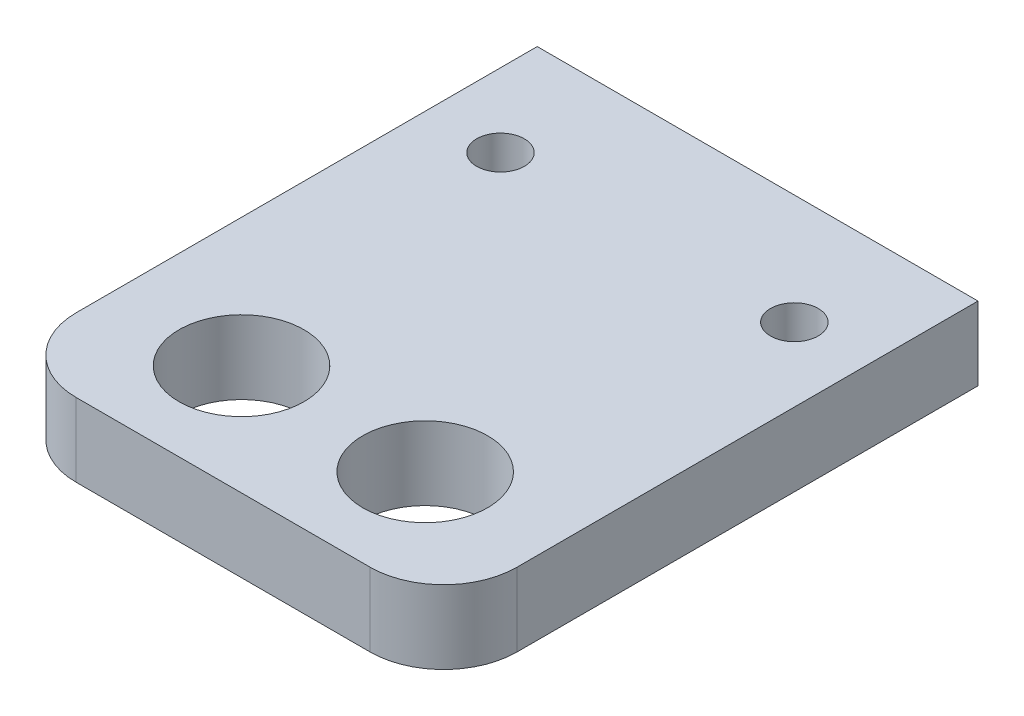
ISO-10303-21;
HEADER;
FILE_DESCRIPTION(('STEP AP214'),'2;1');
FILE_NAME('part.step','',(''),(''),'','','');
FILE_SCHEMA(('AUTOMOTIVE_DESIGN { 1 0 10303 214 1 1 1 1 }'));
ENDSEC;
DATA;
#1=APPLICATION_CONTEXT('core data for automotive mechanical design processes');
#2=APPLICATION_PROTOCOL_DEFINITION('international standard','automotive_design',2000,#1);
#3=PRODUCT_CONTEXT('',#1,'mechanical');
#4=PRODUCT('Part','Part','',(#3));
#5=PRODUCT_RELATED_PRODUCT_CATEGORY('part','',(#4));
#6=PRODUCT_DEFINITION_FORMATION('','',#4);
#7=PRODUCT_DEFINITION_CONTEXT('part definition',#1,'design');
#8=PRODUCT_DEFINITION('design','',#6,#7);
#9=PRODUCT_DEFINITION_SHAPE('','',#8);
#10=(LENGTH_UNIT() NAMED_UNIT(*) SI_UNIT(.MILLI.,.METRE.));
#11=(NAMED_UNIT(*) PLANE_ANGLE_UNIT() SI_UNIT($,.RADIAN.));
#12=(NAMED_UNIT(*) SI_UNIT($,.STERADIAN.) SOLID_ANGLE_UNIT());
#13=UNCERTAINTY_MEASURE_WITH_UNIT(LENGTH_MEASURE(1.E-05),#10,'distance_accuracy_value','');
#14=(GEOMETRIC_REPRESENTATION_CONTEXT(3) GLOBAL_UNCERTAINTY_ASSIGNED_CONTEXT((#13)) GLOBAL_UNIT_ASSIGNED_CONTEXT((#10,
#11,#12)) REPRESENTATION_CONTEXT('',''));
#15=CARTESIAN_POINT('',(0.,0.,0.));
#16=DIRECTION('',(0.,0.,1.));
#17=DIRECTION('',(1.,0.,0.));
#18=AXIS2_PLACEMENT_3D('',#15,#16,#17);
#19=CARTESIAN_POINT('',(60.,10.,0.));
#20=DIRECTION('',(1.,0.,0.));
#21=DIRECTION('',(0.,0.,-1.));
#22=AXIS2_PLACEMENT_3D('',#19,#20,#21);
#23=PLANE('',#22);
#24=DIRECTION('',(0.,0.,1.));
#25=VECTOR('',#24,1.);
#26=CARTESIAN_POINT('',(60.,10.,0.));
#27=LINE('',#26,#25);
#28=CARTESIAN_POINT('',(60.,10.,-72.75));
#29=VERTEX_POINT('',#28);
#30=CARTESIAN_POINT('',(60.,10.,-10.));
#31=VERTEX_POINT('',#30);
#32=EDGE_CURVE('E94',#29,#31,#27,.T.);
#33=ORIENTED_EDGE('',*,*,#32,.T.);
#34=DIRECTION('',(0.,-1.,0.));
#35=VECTOR('',#34,1.);
#36=CARTESIAN_POINT('',(60.,0.,-10.));
#37=LINE('',#36,#35);
#38=CARTESIAN_POINT('',(60.,0.,-10.));
#39=VERTEX_POINT('',#38);
#40=EDGE_CURVE('E102',#31,#39,#37,.T.);
#41=ORIENTED_EDGE('',*,*,#40,.T.);
#42=DIRECTION('',(0.,0.,1.));
#43=VECTOR('',#42,1.);
#44=CARTESIAN_POINT('',(60.,0.,0.));
#45=LINE('',#44,#43);
#46=CARTESIAN_POINT('',(60.,0.,-72.75));
#47=VERTEX_POINT('',#46);
#48=EDGE_CURVE('E97',#47,#39,#45,.T.);
#49=ORIENTED_EDGE('',*,*,#48,.F.);
#50=DIRECTION('',(0.,-1.,0.));
#51=VECTOR('',#50,1.);
#52=CARTESIAN_POINT('',(60.,10.,-72.75));
#53=LINE('',#52,#51);
#54=EDGE_CURVE('E91',#29,#47,#53,.T.);
#55=ORIENTED_EDGE('',*,*,#54,.F.);
#56=EDGE_LOOP('',(#33,#41,#49,#55));
#57=FACE_BOUND('',#56,.T.);
#58=ADVANCED_FACE('F36',(#57),#23,.T.);
#59=CARTESIAN_POINT('',(0.,10.,-72.75));
#60=DIRECTION('',(0.,0.,-1.));
#61=DIRECTION('',(-1.,0.,0.));
#62=AXIS2_PLACEMENT_3D('',#59,#60,#61);
#63=PLANE('',#62);
#64=DIRECTION('',(1.,0.,0.));
#65=VECTOR('',#64,1.);
#66=CARTESIAN_POINT('',(0.,0.,-72.75));
#67=LINE('',#66,#65);
#68=CARTESIAN_POINT('',(0.,0.,-72.75));
#69=VERTEX_POINT('',#68);
#70=EDGE_CURVE('E133',#69,#47,#67,.T.);
#71=ORIENTED_EDGE('',*,*,#70,.F.);
#72=DIRECTION('',(0.,-1.,0.));
#73=VECTOR('',#72,1.);
#74=CARTESIAN_POINT('',(0.,10.,-72.75));
#75=LINE('',#74,#73);
#76=CARTESIAN_POINT('',(0.,10.,-72.75));
#77=VERTEX_POINT('',#76);
#78=EDGE_CURVE('E103',#77,#69,#75,.T.);
#79=ORIENTED_EDGE('',*,*,#78,.F.);
#80=DIRECTION('',(1.,0.,0.));
#81=VECTOR('',#80,1.);
#82=CARTESIAN_POINT('',(0.,10.,-72.75));
#83=LINE('',#82,#81);
#84=EDGE_CURVE('E108',#77,#29,#83,.T.);
#85=ORIENTED_EDGE('',*,*,#84,.T.);
#86=ORIENTED_EDGE('',*,*,#54,.T.);
#87=EDGE_LOOP('',(#71,#79,#85,#86));
#88=FACE_BOUND('',#87,.T.);
#89=ADVANCED_FACE('F112',(#88),#63,.T.);
#90=CARTESIAN_POINT('',(0.,10.,0.));
#91=DIRECTION('',(1.,0.,0.));
#92=DIRECTION('',(0.,0.,-1.));
#93=AXIS2_PLACEMENT_3D('',#90,#91,#92);
#94=PLANE('',#93);
#95=DIRECTION('',(0.,0.,1.));
#96=VECTOR('',#95,1.);
#97=CARTESIAN_POINT('',(0.,0.,0.));
#98=LINE('',#97,#96);
#99=CARTESIAN_POINT('',(0.,0.,-10.));
#100=VERTEX_POINT('',#99);
#101=EDGE_CURVE('E135',#69,#100,#98,.T.);
#102=ORIENTED_EDGE('',*,*,#101,.T.);
#103=DIRECTION('',(0.,-1.,0.));
#104=VECTOR('',#103,1.);
#105=CARTESIAN_POINT('',(0.,10.,-10.));
#106=LINE('',#105,#104);
#107=CARTESIAN_POINT('',(0.,10.,-10.));
#108=VERTEX_POINT('',#107);
#109=EDGE_CURVE('E11',#100,#108,#106,.F.);
#110=ORIENTED_EDGE('',*,*,#109,.T.);
#111=DIRECTION('',(0.,0.,1.));
#112=VECTOR('',#111,1.);
#113=CARTESIAN_POINT('',(0.,10.,0.));
#114=LINE('',#113,#112);
#115=EDGE_CURVE('E113',#77,#108,#114,.T.);
#116=ORIENTED_EDGE('',*,*,#115,.F.);
#117=ORIENTED_EDGE('',*,*,#78,.T.);
#118=EDGE_LOOP('',(#102,#110,#116,#117));
#119=FACE_BOUND('',#118,.T.);
#120=ADVANCED_FACE('F159',(#119),#94,.F.);
#121=CARTESIAN_POINT('',(10.,10.,-57.75));
#122=DIRECTION('',(0.,-1.,0.));
#123=DIRECTION('',(0.,0.,-1.));
#124=AXIS2_PLACEMENT_3D('',#121,#122,#123);
#125=CYLINDRICAL_SURFACE('',#124,3.25);
#126=CARTESIAN_POINT('',(10.,10.,-57.75));
#127=DIRECTION('',(0.,1.,0.));
#128=DIRECTION('',(0.,0.,1.));
#129=AXIS2_PLACEMENT_3D('',#126,#127,#128);
#130=CIRCLE('',#129,3.25);
#131=CARTESIAN_POINT('',(10.,10.,-54.5));
#132=VERTEX_POINT('',#131);
#133=EDGE_CURVE('E110',#132,#132,#130,.T.);
#134=ORIENTED_EDGE('',*,*,#133,.T.);
#135=EDGE_LOOP('',(#134));
#136=FACE_BOUND('',#135,.T.);
#137=CARTESIAN_POINT('',(10.,0.,-57.75));
#138=DIRECTION('',(0.,1.,0.));
#139=DIRECTION('',(0.,0.,1.));
#140=AXIS2_PLACEMENT_3D('',#137,#138,#139);
#141=CIRCLE('',#140,3.25);
#142=CARTESIAN_POINT('',(10.,0.,-54.5));
#143=VERTEX_POINT('',#142);
#144=EDGE_CURVE('E129',#143,#143,#141,.T.);
#145=ORIENTED_EDGE('',*,*,#144,.F.);
#146=EDGE_LOOP('',(#145));
#147=FACE_BOUND('',#146,.T.);
#148=ADVANCED_FACE('F161',(#136,#147),#125,.F.);
#149=CARTESIAN_POINT('',(17.5,10.,-15.));
#150=DIRECTION('',(0.,-1.,0.));
#151=DIRECTION('',(0.,0.,-1.));
#152=AXIS2_PLACEMENT_3D('',#149,#150,#151);
#153=CYLINDRICAL_SURFACE('',#152,8.5);
#154=CARTESIAN_POINT('',(17.5,10.,-15.));
#155=DIRECTION('',(0.,1.,0.));
#156=DIRECTION('',(0.,0.,1.));
#157=AXIS2_PLACEMENT_3D('',#154,#155,#156);
#158=CIRCLE('',#157,8.5);
#159=CARTESIAN_POINT('',(17.5,10.,-6.50000000000001));
#160=VERTEX_POINT('',#159);
#161=EDGE_CURVE('E299',#160,#160,#158,.T.);
#162=ORIENTED_EDGE('',*,*,#161,.T.);
#163=EDGE_LOOP('',(#162));
#164=FACE_BOUND('',#163,.T.);
#165=CARTESIAN_POINT('',(17.5,0.,-15.));
#166=DIRECTION('',(0.,1.,0.));
#167=DIRECTION('',(0.,0.,1.));
#168=AXIS2_PLACEMENT_3D('',#165,#166,#167);
#169=CIRCLE('',#168,8.5);
#170=CARTESIAN_POINT('',(17.5,0.,-6.50000000000001));
#171=VERTEX_POINT('',#170);
#172=EDGE_CURVE('E126',#171,#171,#169,.T.);
#173=ORIENTED_EDGE('',*,*,#172,.F.);
#174=EDGE_LOOP('',(#173));
#175=FACE_BOUND('',#174,.T.);
#176=ADVANCED_FACE('F167',(#164,#175),#153,.F.);
#177=CARTESIAN_POINT('',(50.,10.,-57.75));
#178=DIRECTION('',(0.,-1.,0.));
#179=DIRECTION('',(0.,0.,-1.));
#180=AXIS2_PLACEMENT_3D('',#177,#178,#179);
#181=CYLINDRICAL_SURFACE('',#180,3.24999999999999);
#182=CARTESIAN_POINT('',(50.,10.,-57.75));
#183=DIRECTION('',(0.,1.,0.));
#184=DIRECTION('',(0.,0.,1.));
#185=AXIS2_PLACEMENT_3D('',#182,#183,#184);
#186=CIRCLE('',#185,3.24999999999999);
#187=CARTESIAN_POINT('',(50.,10.,-54.5));
#188=VERTEX_POINT('',#187);
#189=EDGE_CURVE('E295',#188,#188,#186,.T.);
#190=ORIENTED_EDGE('',*,*,#189,.T.);
#191=EDGE_LOOP('',(#190));
#192=FACE_BOUND('',#191,.T.);
#193=CARTESIAN_POINT('',(50.,0.,-57.75));
#194=DIRECTION('',(0.,1.,0.));
#195=DIRECTION('',(0.,0.,1.));
#196=AXIS2_PLACEMENT_3D('',#193,#194,#195);
#197=CIRCLE('',#196,3.24999999999999);
#198=CARTESIAN_POINT('',(50.,0.,-54.5));
#199=VERTEX_POINT('',#198);
#200=EDGE_CURVE('E123',#199,#199,#197,.T.);
#201=ORIENTED_EDGE('',*,*,#200,.F.);
#202=EDGE_LOOP('',(#201));
#203=FACE_BOUND('',#202,.T.);
#204=ADVANCED_FACE('F179',(#192,#203),#181,.F.);
#205=CARTESIAN_POINT('',(42.5,10.,-15.));
#206=DIRECTION('',(0.,-1.,0.));
#207=DIRECTION('',(0.,0.,-1.));
#208=AXIS2_PLACEMENT_3D('',#205,#206,#207);
#209=CYLINDRICAL_SURFACE('',#208,8.5);
#210=CARTESIAN_POINT('',(42.5,10.,-15.));
#211=DIRECTION('',(0.,1.,0.));
#212=DIRECTION('',(0.,0.,1.));
#213=AXIS2_PLACEMENT_3D('',#210,#211,#212);
#214=CIRCLE('',#213,8.5);
#215=CARTESIAN_POINT('',(42.5,10.,-6.5));
#216=VERTEX_POINT('',#215);
#217=EDGE_CURVE('E139',#216,#216,#214,.T.);
#218=ORIENTED_EDGE('',*,*,#217,.T.);
#219=EDGE_LOOP('',(#218));
#220=FACE_BOUND('',#219,.T.);
#221=CARTESIAN_POINT('',(42.5,0.,-15.));
#222=DIRECTION('',(0.,1.,0.));
#223=DIRECTION('',(0.,0.,1.));
#224=AXIS2_PLACEMENT_3D('',#221,#222,#223);
#225=CIRCLE('',#224,8.5);
#226=CARTESIAN_POINT('',(42.5,0.,-6.5));
#227=VERTEX_POINT('',#226);
#228=EDGE_CURVE('E120',#227,#227,#225,.T.);
#229=ORIENTED_EDGE('',*,*,#228,.F.);
#230=EDGE_LOOP('',(#229));
#231=FACE_BOUND('',#230,.T.);
#232=ADVANCED_FACE('F183',(#220,#231),#209,.F.);
#233=CARTESIAN_POINT('',(0.,10.,0.));
#234=DIRECTION('',(0.,0.,-1.));
#235=DIRECTION('',(-1.,0.,0.));
#236=AXIS2_PLACEMENT_3D('',#233,#234,#235);
#237=PLANE('',#236);
#238=DIRECTION('',(1.,0.,0.));
#239=VECTOR('',#238,1.);
#240=CARTESIAN_POINT('',(0.,0.,0.));
#241=LINE('',#240,#239);
#242=CARTESIAN_POINT('',(10.,0.,0.));
#243=VERTEX_POINT('',#242);
#244=CARTESIAN_POINT('',(50.,0.,0.));
#245=VERTEX_POINT('',#244);
#246=EDGE_CURVE('E137',#243,#245,#241,.T.);
#247=ORIENTED_EDGE('',*,*,#246,.T.);
#248=DIRECTION('',(0.,-1.,0.));
#249=VECTOR('',#248,1.);
#250=CARTESIAN_POINT('',(50.,10.,0.));
#251=LINE('',#250,#249);
#252=CARTESIAN_POINT('',(50.,10.,0.));
#253=VERTEX_POINT('',#252);
#254=EDGE_CURVE('E57',#245,#253,#251,.F.);
#255=ORIENTED_EDGE('',*,*,#254,.T.);
#256=DIRECTION('',(1.,0.,0.));
#257=VECTOR('',#256,1.);
#258=CARTESIAN_POINT('',(0.,10.,0.));
#259=LINE('',#258,#257);
#260=CARTESIAN_POINT('',(10.,10.,0.));
#261=VERTEX_POINT('',#260);
#262=EDGE_CURVE('E115',#261,#253,#259,.T.);
#263=ORIENTED_EDGE('',*,*,#262,.F.);
#264=DIRECTION('',(0.,-1.,0.));
#265=VECTOR('',#264,1.);
#266=CARTESIAN_POINT('',(10.,10.,0.));
#267=LINE('',#266,#265);
#268=EDGE_CURVE('E146',#261,#243,#267,.T.);
#269=ORIENTED_EDGE('',*,*,#268,.T.);
#270=EDGE_LOOP('',(#247,#255,#263,#269));
#271=FACE_BOUND('',#270,.T.);
#272=ADVANCED_FACE('F154',(#271),#237,.F.);
#273=CARTESIAN_POINT('',(0.,10.,0.));
#274=DIRECTION('',(0.,1.,0.));
#275=DIRECTION('',(0.,0.,1.));
#276=AXIS2_PLACEMENT_3D('',#273,#274,#275);
#277=PLANE('',#276);
#278=ORIENTED_EDGE('',*,*,#217,.F.);
#279=EDGE_LOOP('',(#278));
#280=FACE_BOUND('',#279,.T.);
#281=ORIENTED_EDGE('',*,*,#189,.F.);
#282=EDGE_LOOP('',(#281));
#283=FACE_BOUND('',#282,.T.);
#284=ORIENTED_EDGE('',*,*,#161,.F.);
#285=EDGE_LOOP('',(#284));
#286=FACE_BOUND('',#285,.T.);
#287=ORIENTED_EDGE('',*,*,#133,.F.);
#288=EDGE_LOOP('',(#287));
#289=FACE_BOUND('',#288,.T.);
#290=ORIENTED_EDGE('',*,*,#262,.T.);
#291=CARTESIAN_POINT('',(50.,10.,-10.));
#292=DIRECTION('',(0.,1.,0.));
#293=DIRECTION('',(0.,0.,1.));
#294=AXIS2_PLACEMENT_3D('',#291,#292,#293);
#295=CIRCLE('',#294,10.);
#296=EDGE_CURVE('E44',#253,#31,#295,.T.);
#297=ORIENTED_EDGE('',*,*,#296,.T.);
#298=ORIENTED_EDGE('',*,*,#32,.F.);
#299=ORIENTED_EDGE('',*,*,#84,.F.);
#300=ORIENTED_EDGE('',*,*,#115,.T.);
#301=CARTESIAN_POINT('',(10.,10.,-10.));
#302=DIRECTION('',(0.,1.,0.));
#303=DIRECTION('',(0.,0.,1.));
#304=AXIS2_PLACEMENT_3D('',#301,#302,#303);
#305=CIRCLE('',#304,10.);
#306=EDGE_CURVE('E150',#108,#261,#305,.T.);
#307=ORIENTED_EDGE('',*,*,#306,.T.);
#308=EDGE_LOOP('',(#290,#297,#298,#299,#300,#307));
#309=FACE_BOUND('',#308,.T.);
#310=ADVANCED_FACE('F107',(#280,#283,#286,#289,#309),#277,.T.);
#311=CARTESIAN_POINT('',(0.,0.,0.));
#312=DIRECTION('',(0.,1.,0.));
#313=DIRECTION('',(0.,0.,1.));
#314=AXIS2_PLACEMENT_3D('',#311,#312,#313);
#315=PLANE('',#314);
#316=ORIENTED_EDGE('',*,*,#228,.T.);
#317=EDGE_LOOP('',(#316));
#318=FACE_BOUND('',#317,.T.);
#319=ORIENTED_EDGE('',*,*,#200,.T.);
#320=EDGE_LOOP('',(#319));
#321=FACE_BOUND('',#320,.T.);
#322=ORIENTED_EDGE('',*,*,#172,.T.);
#323=EDGE_LOOP('',(#322));
#324=FACE_BOUND('',#323,.T.);
#325=ORIENTED_EDGE('',*,*,#144,.T.);
#326=EDGE_LOOP('',(#325));
#327=FACE_BOUND('',#326,.T.);
#328=ORIENTED_EDGE('',*,*,#48,.T.);
#329=CARTESIAN_POINT('',(50.,0.,-10.));
#330=DIRECTION('',(0.,1.,0.));
#331=DIRECTION('',(0.,0.,1.));
#332=AXIS2_PLACEMENT_3D('',#329,#330,#331);
#333=CIRCLE('',#332,10.);
#334=EDGE_CURVE('E144',#39,#245,#333,.F.);
#335=ORIENTED_EDGE('',*,*,#334,.T.);
#336=ORIENTED_EDGE('',*,*,#246,.F.);
#337=CARTESIAN_POINT('',(10.,0.,-10.));
#338=DIRECTION('',(0.,1.,0.));
#339=DIRECTION('',(0.,0.,1.));
#340=AXIS2_PLACEMENT_3D('',#337,#338,#339);
#341=CIRCLE('',#340,10.);
#342=EDGE_CURVE('E142',#243,#100,#341,.F.);
#343=ORIENTED_EDGE('',*,*,#342,.T.);
#344=ORIENTED_EDGE('',*,*,#101,.F.);
#345=ORIENTED_EDGE('',*,*,#70,.T.);
#346=EDGE_LOOP('',(#328,#335,#336,#343,#344,#345));
#347=FACE_BOUND('',#346,.T.);
#348=ADVANCED_FACE('F158',(#318,#321,#324,#327,#347),#315,.F.);
#349=CARTESIAN_POINT('',(50.,10.,-10.));
#350=DIRECTION('',(0.,1.,0.));
#351=DIRECTION('',(0.,0.,1.));
#352=AXIS2_PLACEMENT_3D('',#349,#350,#351);
#353=CYLINDRICAL_SURFACE('',#352,10.);
#354=ORIENTED_EDGE('',*,*,#296,.F.);
#355=ORIENTED_EDGE('',*,*,#254,.F.);
#356=ORIENTED_EDGE('',*,*,#334,.F.);
#357=ORIENTED_EDGE('',*,*,#40,.F.);
#358=EDGE_LOOP('',(#354,#355,#356,#357));
#359=FACE_BOUND('',#358,.T.);
#360=ADVANCED_FACE('F187',(#359),#353,.T.);
#361=CARTESIAN_POINT('',(10.,10.,-10.));
#362=DIRECTION('',(0.,-1.,0.));
#363=DIRECTION('',(0.,0.,-1.));
#364=AXIS2_PLACEMENT_3D('',#361,#362,#363);
#365=CYLINDRICAL_SURFACE('',#364,10.);
#366=ORIENTED_EDGE('',*,*,#306,.F.);
#367=ORIENTED_EDGE('',*,*,#109,.F.);
#368=ORIENTED_EDGE('',*,*,#342,.F.);
#369=ORIENTED_EDGE('',*,*,#268,.F.);
#370=EDGE_LOOP('',(#366,#367,#368,#369));
#371=FACE_BOUND('',#370,.T.);
#372=ADVANCED_FACE('F38',(#371),#365,.T.);
#373=CLOSED_SHELL('',(#58,#89,#120,#148,#176,#204,#232,#272,#310,#348,#360,#372));
#374=MANIFOLD_SOLID_BREP('B2',#373);
#375=ADVANCED_BREP_SHAPE_REPRESENTATION('',(#18,#374),#14);
#376=SHAPE_DEFINITION_REPRESENTATION(#9,#375);
ENDSEC;
END-ISO-10303-21;
